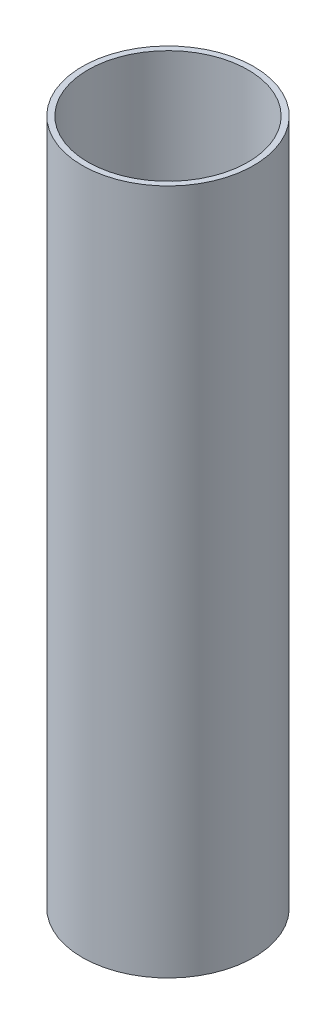
ISO-10303-21;
HEADER;
FILE_DESCRIPTION(('STEP AP214'),'2;1');
FILE_NAME('part.step','',(''),(''),'','','');
FILE_SCHEMA(('AUTOMOTIVE_DESIGN { 1 0 10303 214 1 1 1 1 }'));
ENDSEC;
DATA;
#1=APPLICATION_CONTEXT('core data for automotive mechanical design processes');
#2=APPLICATION_PROTOCOL_DEFINITION('international standard','automotive_design',2000,#1);
#3=PRODUCT_CONTEXT('',#1,'mechanical');
#4=PRODUCT('Part','Part','',(#3));
#5=PRODUCT_RELATED_PRODUCT_CATEGORY('part','',(#4));
#6=PRODUCT_DEFINITION_FORMATION('','',#4);
#7=PRODUCT_DEFINITION_CONTEXT('part definition',#1,'design');
#8=PRODUCT_DEFINITION('design','',#6,#7);
#9=PRODUCT_DEFINITION_SHAPE('','',#8);
#10=(LENGTH_UNIT() NAMED_UNIT(*) SI_UNIT(.MILLI.,.METRE.));
#11=(NAMED_UNIT(*) PLANE_ANGLE_UNIT() SI_UNIT($,.RADIAN.));
#12=(NAMED_UNIT(*) SI_UNIT($,.STERADIAN.) SOLID_ANGLE_UNIT());
#13=UNCERTAINTY_MEASURE_WITH_UNIT(LENGTH_MEASURE(1.E-05),#10,'distance_accuracy_value','');
#14=(GEOMETRIC_REPRESENTATION_CONTEXT(3) GLOBAL_UNCERTAINTY_ASSIGNED_CONTEXT((#13)) GLOBAL_UNIT_ASSIGNED_CONTEXT((#10,
#11,#12)) REPRESENTATION_CONTEXT('',''));
#15=CARTESIAN_POINT('',(0.,0.,0.));
#16=DIRECTION('',(0.,0.,1.));
#17=DIRECTION('',(1.,0.,0.));
#18=AXIS2_PLACEMENT_3D('',#15,#16,#17);
#19=CARTESIAN_POINT('',(0.,240.,0.));
#20=DIRECTION('',(0.,-1.,0.));
#21=DIRECTION('',(0.,0.,-1.));
#22=AXIS2_PLACEMENT_3D('',#19,#20,#21);
#23=CYLINDRICAL_SURFACE('',#22,60.);
#24=CARTESIAN_POINT('',(0.,240.,0.));
#25=DIRECTION('',(0.,1.,0.));
#26=DIRECTION('',(0.,0.,1.));
#27=AXIS2_PLACEMENT_3D('',#24,#25,#26);
#28=CIRCLE('',#27,60.);
#29=CARTESIAN_POINT('',(0.,240.,60.));
#30=VERTEX_POINT('',#29);
#31=EDGE_CURVE('E10',#30,#30,#28,.T.);
#32=ORIENTED_EDGE('',*,*,#31,.F.);
#33=EDGE_LOOP('',(#32));
#34=FACE_BOUND('',#33,.T.);
#35=CARTESIAN_POINT('',(0.,-240.,0.));
#36=DIRECTION('',(0.,1.,0.));
#37=DIRECTION('',(0.,0.,1.));
#38=AXIS2_PLACEMENT_3D('',#35,#36,#37);
#39=CIRCLE('',#38,60.);
#40=CARTESIAN_POINT('',(0.,-240.,60.));
#41=VERTEX_POINT('',#40);
#42=EDGE_CURVE('E48',#41,#41,#39,.T.);
#43=ORIENTED_EDGE('',*,*,#42,.T.);
#44=EDGE_LOOP('',(#43));
#45=FACE_BOUND('',#44,.T.);
#46=ADVANCED_FACE('F45',(#34,#45),#23,.T.);
#47=CARTESIAN_POINT('',(0.,240.,0.));
#48=DIRECTION('',(0.,1.,0.));
#49=DIRECTION('',(0.,0.,1.));
#50=AXIS2_PLACEMENT_3D('',#47,#48,#49);
#51=PLANE('',#50);
#52=CARTESIAN_POINT('',(0.,240.,0.));
#53=DIRECTION('',(0.,1.,0.));
#54=DIRECTION('',(0.,0.,1.));
#55=AXIS2_PLACEMENT_3D('',#52,#53,#54);
#56=CIRCLE('',#55,56.);
#57=CARTESIAN_POINT('',(0.,240.,56.));
#58=VERTEX_POINT('',#57);
#59=EDGE_CURVE('E57',#58,#58,#56,.T.);
#60=ORIENTED_EDGE('',*,*,#59,.F.);
#61=EDGE_LOOP('',(#60));
#62=FACE_BOUND('',#61,.T.);
#63=ORIENTED_EDGE('',*,*,#31,.T.);
#64=EDGE_LOOP('',(#63));
#65=FACE_BOUND('',#64,.T.);
#66=ADVANCED_FACE('F80',(#62,#65),#51,.T.);
#67=CARTESIAN_POINT('',(0.,-240.,0.));
#68=DIRECTION('',(0.,1.,0.));
#69=DIRECTION('',(0.,0.,1.));
#70=AXIS2_PLACEMENT_3D('',#67,#68,#69);
#71=PLANE('',#70);
#72=ORIENTED_EDGE('',*,*,#42,.F.);
#73=EDGE_LOOP('',(#72));
#74=FACE_BOUND('',#73,.T.);
#75=ADVANCED_FACE('F71',(#74),#71,.F.);
#76=CARTESIAN_POINT('',(0.,240.,0.));
#77=DIRECTION('',(0.,-1.,0.));
#78=DIRECTION('',(0.,0.,-1.));
#79=AXIS2_PLACEMENT_3D('',#76,#77,#78);
#80=CYLINDRICAL_SURFACE('',#79,56.);
#81=ORIENTED_EDGE('',*,*,#59,.T.);
#82=EDGE_LOOP('',(#81));
#83=FACE_BOUND('',#82,.T.);
#84=CARTESIAN_POINT('',(0.,-236.,0.));
#85=DIRECTION('',(0.,1.,0.));
#86=DIRECTION('',(0.,0.,1.));
#87=AXIS2_PLACEMENT_3D('',#84,#85,#86);
#88=CIRCLE('',#87,56.);
#89=CARTESIAN_POINT('',(0.,-236.,56.));
#90=VERTEX_POINT('',#89);
#91=EDGE_CURVE('E62',#90,#90,#88,.T.);
#92=ORIENTED_EDGE('',*,*,#91,.F.);
#93=EDGE_LOOP('',(#92));
#94=FACE_BOUND('',#93,.T.);
#95=ADVANCED_FACE('F69',(#83,#94),#80,.F.);
#96=CARTESIAN_POINT('',(0.,-236.,0.));
#97=DIRECTION('',(0.,1.,0.));
#98=DIRECTION('',(0.,0.,1.));
#99=AXIS2_PLACEMENT_3D('',#96,#97,#98);
#100=PLANE('',#99);
#101=ORIENTED_EDGE('',*,*,#91,.T.);
#102=EDGE_LOOP('',(#101));
#103=FACE_BOUND('',#102,.T.);
#104=ADVANCED_FACE('F67',(#103),#100,.T.);
#105=CLOSED_SHELL('',(#46,#66,#75,#95,#104));
#106=MANIFOLD_SOLID_BREP('B2',#105);
#107=ADVANCED_BREP_SHAPE_REPRESENTATION('',(#18,#106),#14);
#108=SHAPE_DEFINITION_REPRESENTATION(#9,#107);
ENDSEC;
END-ISO-10303-21;
